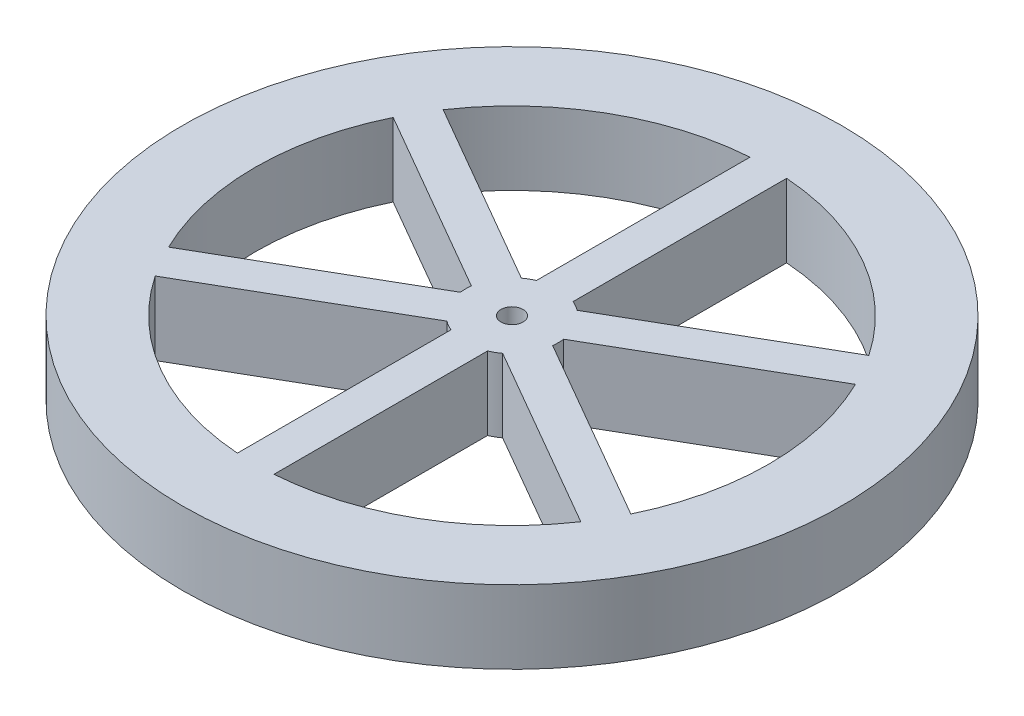
ISO-10303-21;
HEADER;
FILE_DESCRIPTION(('STEP AP214'),'2;1');
FILE_NAME('part.step','',(''),(''),'','','');
FILE_SCHEMA(('AUTOMOTIVE_DESIGN { 1 0 10303 214 1 1 1 1 }'));
ENDSEC;
DATA;
#1=APPLICATION_CONTEXT('core data for automotive mechanical design processes');
#2=APPLICATION_PROTOCOL_DEFINITION('international standard','automotive_design',2000,#1);
#3=PRODUCT_CONTEXT('',#1,'mechanical');
#4=PRODUCT('Part','Part','',(#3));
#5=PRODUCT_RELATED_PRODUCT_CATEGORY('part','',(#4));
#6=PRODUCT_DEFINITION_FORMATION('','',#4);
#7=PRODUCT_DEFINITION_CONTEXT('part definition',#1,'design');
#8=PRODUCT_DEFINITION('design','',#6,#7);
#9=PRODUCT_DEFINITION_SHAPE('','',#8);
#10=(LENGTH_UNIT() NAMED_UNIT(*) SI_UNIT(.MILLI.,.METRE.));
#11=(NAMED_UNIT(*) PLANE_ANGLE_UNIT() SI_UNIT($,.RADIAN.));
#12=(NAMED_UNIT(*) SI_UNIT($,.STERADIAN.) SOLID_ANGLE_UNIT());
#13=UNCERTAINTY_MEASURE_WITH_UNIT(LENGTH_MEASURE(1.E-05),#10,'distance_accuracy_value','');
#14=(GEOMETRIC_REPRESENTATION_CONTEXT(3) GLOBAL_UNCERTAINTY_ASSIGNED_CONTEXT((#13)) GLOBAL_UNIT_ASSIGNED_CONTEXT((#10,
#11,#12)) REPRESENTATION_CONTEXT('',''));
#15=CARTESIAN_POINT('',(0.,0.,0.));
#16=DIRECTION('',(0.,0.,1.));
#17=DIRECTION('',(1.,0.,0.));
#18=AXIS2_PLACEMENT_3D('',#15,#16,#17);
#19=CARTESIAN_POINT('',(0.,10.,0.));
#20=DIRECTION('',(0.,1.,0.));
#21=DIRECTION('',(0.,0.,1.));
#22=AXIS2_PLACEMENT_3D('',#19,#20,#21);
#23=PLANE('',#22);
#24=CARTESIAN_POINT('',(0.,10.,0.));
#25=DIRECTION('',(0.,1.,0.));
#26=DIRECTION('',(0.,0.,1.));
#27=AXIS2_PLACEMENT_3D('',#24,#25,#26);
#28=CIRCLE('',#27,45.);
#29=CARTESIAN_POINT('',(0.,10.,45.));
#30=VERTEX_POINT('',#29);
#31=EDGE_CURVE('E11',#30,#30,#28,.T.);
#32=ORIENTED_EDGE('',*,*,#31,.T.);
#33=EDGE_LOOP('',(#32));
#34=FACE_BOUND('',#33,.T.);
#35=CARTESIAN_POINT('',(0.,10.,0.));
#36=DIRECTION('',(0.,1.,0.));
#37=DIRECTION('',(0.,0.,1.));
#38=AXIS2_PLACEMENT_3D('',#35,#36,#37);
#39=CIRCLE('',#38,1.5);
#40=CARTESIAN_POINT('',(0.,10.,1.5));
#41=VERTEX_POINT('',#40);
#42=EDGE_CURVE('E464',#41,#41,#39,.T.);
#43=ORIENTED_EDGE('',*,*,#42,.F.);
#44=EDGE_LOOP('',(#43));
#45=FACE_BOUND('',#44,.T.);
#46=DIRECTION('',(0.,0.,-1.));
#47=VECTOR('',#46,1.);
#48=CARTESIAN_POINT('',(-2.49999999999995,10.,-5.83716540796992));
#49=LINE('',#48,#47);
#50=CARTESIAN_POINT('',(-2.49999999999995,10.,-5.83716540796992));
#51=VERTEX_POINT('',#50);
#52=CARTESIAN_POINT('',(-2.49999999999996,10.,-35.));
#53=VERTEX_POINT('',#52);
#54=EDGE_CURVE('E424',#51,#53,#49,.T.);
#55=ORIENTED_EDGE('',*,*,#54,.F.);
#56=CARTESIAN_POINT('',(0.,10.,0.));
#57=DIRECTION('',(0.,-1.,0.));
#58=DIRECTION('',(0.,0.,1.));
#59=AXIS2_PLACEMENT_3D('',#56,#57,#58);
#60=CIRCLE('',#59,6.35000000000004);
#61=CARTESIAN_POINT('',(-3.80513352939374,10.,-5.08364621344602));
#62=VERTEX_POINT('',#61);
#63=EDGE_CURVE('E421',#62,#51,#60,.T.);
#64=ORIENTED_EDGE('',*,*,#63,.F.);
#65=DIRECTION('',(0.866025403784439,0.,0.5));
#66=VECTOR('',#65,1.);
#67=CARTESIAN_POINT('',(-3.80513352939374,10.,-5.08364621344602));
#68=LINE('',#67,#66);
#69=CARTESIAN_POINT('',(-29.0608891324554,10.,-19.665063509461));
#70=VERTEX_POINT('',#69);
#71=EDGE_CURVE('E432',#70,#62,#68,.T.);
#72=ORIENTED_EDGE('',*,*,#71,.F.);
#73=CARTESIAN_POINT('',(0.,10.,0.));
#74=DIRECTION('',(0.,1.,0.));
#75=DIRECTION('',(0.,0.,1.));
#76=AXIS2_PLACEMENT_3D('',#73,#74,#75);
#77=CIRCLE('',#76,35.0891721190455);
#78=EDGE_CURVE('E428',#53,#70,#77,.T.);
#79=ORIENTED_EDGE('',*,*,#78,.F.);
#80=EDGE_LOOP('',(#55,#64,#72,#79));
#81=FACE_BOUND('',#80,.T.);
#82=DIRECTION('',(0.866025403784438,0.,-0.5));
#83=VECTOR('',#82,1.);
#84=CARTESIAN_POINT('',(3.80513352939373,10.,-5.08364621344601));
#85=LINE('',#84,#83);
#86=CARTESIAN_POINT('',(3.80513352939373,10.,-5.08364621344601));
#87=VERTEX_POINT('',#86);
#88=CARTESIAN_POINT('',(29.0608891324554,10.,-19.6650635094611));
#89=VERTEX_POINT('',#88);
#90=EDGE_CURVE('E381',#87,#89,#85,.T.);
#91=ORIENTED_EDGE('',*,*,#90,.F.);
#92=CARTESIAN_POINT('',(0.,10.,0.));
#93=DIRECTION('',(0.,-1.,0.));
#94=DIRECTION('',(0.,0.,1.));
#95=AXIS2_PLACEMENT_3D('',#92,#93,#94);
#96=CIRCLE('',#95,6.35000000000004);
#97=CARTESIAN_POINT('',(2.49999999999996,10.,-5.83716540796993));
#98=VERTEX_POINT('',#97);
#99=EDGE_CURVE('E378',#98,#87,#96,.T.);
#100=ORIENTED_EDGE('',*,*,#99,.F.);
#101=DIRECTION('',(0.,0.,1.));
#102=VECTOR('',#101,1.);
#103=CARTESIAN_POINT('',(2.49999999999996,10.,-5.83716540796993));
#104=LINE('',#103,#102);
#105=CARTESIAN_POINT('',(2.49999999999996,10.,-35.));
#106=VERTEX_POINT('',#105);
#107=EDGE_CURVE('E389',#106,#98,#104,.T.);
#108=ORIENTED_EDGE('',*,*,#107,.F.);
#109=CARTESIAN_POINT('',(0.,10.,0.));
#110=DIRECTION('',(0.,1.,0.));
#111=DIRECTION('',(0.,0.,1.));
#112=AXIS2_PLACEMENT_3D('',#109,#110,#111);
#113=CIRCLE('',#112,35.0891721190455);
#114=EDGE_CURVE('E385',#89,#106,#113,.T.);
#115=ORIENTED_EDGE('',*,*,#114,.F.);
#116=EDGE_LOOP('',(#91,#100,#108,#115));
#117=FACE_BOUND('',#116,.T.);
#118=DIRECTION('',(0.866025403784439,0.,0.5));
#119=VECTOR('',#118,1.);
#120=CARTESIAN_POINT('',(6.30513352939368,10.,0.753519194523905));
#121=LINE('',#120,#119);
#122=CARTESIAN_POINT('',(6.30513352939368,10.,0.753519194523905));
#123=VERTEX_POINT('',#122);
#124=CARTESIAN_POINT('',(31.5608891324553,10.,15.3349364905389));
#125=VERTEX_POINT('',#124);
#126=EDGE_CURVE('E338',#123,#125,#121,.T.);
#127=ORIENTED_EDGE('',*,*,#126,.F.);
#128=CARTESIAN_POINT('',(0.,10.,0.));
#129=DIRECTION('',(0.,-1.,0.));
#130=DIRECTION('',(0.,0.,1.));
#131=AXIS2_PLACEMENT_3D('',#128,#129,#130);
#132=CIRCLE('',#131,6.35000000000004);
#133=CARTESIAN_POINT('',(6.30513352939369,10.,-0.753519194523908));
#134=VERTEX_POINT('',#133);
#135=EDGE_CURVE('E335',#134,#123,#132,.T.);
#136=ORIENTED_EDGE('',*,*,#135,.F.);
#137=DIRECTION('',(-0.866025403784438,0.,0.5));
#138=VECTOR('',#137,1.);
#139=CARTESIAN_POINT('',(6.30513352939369,10.,-0.753519194523908));
#140=LINE('',#139,#138);
#141=CARTESIAN_POINT('',(31.5608891324553,10.,-15.3349364905389));
#142=VERTEX_POINT('',#141);
#143=EDGE_CURVE('E346',#142,#134,#140,.T.);
#144=ORIENTED_EDGE('',*,*,#143,.F.);
#145=CARTESIAN_POINT('',(0.,10.,0.));
#146=DIRECTION('',(0.,1.,0.));
#147=DIRECTION('',(0.,0.,1.));
#148=AXIS2_PLACEMENT_3D('',#145,#146,#147);
#149=CIRCLE('',#148,35.0891721190455);
#150=EDGE_CURVE('E342',#125,#142,#149,.T.);
#151=ORIENTED_EDGE('',*,*,#150,.F.);
#152=EDGE_LOOP('',(#127,#136,#144,#151));
#153=FACE_BOUND('',#152,.T.);
#154=DIRECTION('',(0.,0.,1.));
#155=VECTOR('',#154,1.);
#156=CARTESIAN_POINT('',(2.49999999999995,10.,5.83716540796992));
#157=LINE('',#156,#155);
#158=CARTESIAN_POINT('',(2.49999999999995,10.,5.83716540796992));
#159=VERTEX_POINT('',#158);
#160=CARTESIAN_POINT('',(2.49999999999996,10.,35.));
#161=VERTEX_POINT('',#160);
#162=EDGE_CURVE('E295',#159,#161,#157,.T.);
#163=ORIENTED_EDGE('',*,*,#162,.F.);
#164=CARTESIAN_POINT('',(0.,10.,0.));
#165=DIRECTION('',(0.,-1.,0.));
#166=DIRECTION('',(0.,0.,1.));
#167=AXIS2_PLACEMENT_3D('',#164,#165,#166);
#168=CIRCLE('',#167,6.35000000000004);
#169=CARTESIAN_POINT('',(3.80513352939374,10.,5.08364621344602));
#170=VERTEX_POINT('',#169);
#171=EDGE_CURVE('E292',#170,#159,#168,.T.);
#172=ORIENTED_EDGE('',*,*,#171,.F.);
#173=DIRECTION('',(-0.866025403784439,0.,-0.5));
#174=VECTOR('',#173,1.);
#175=CARTESIAN_POINT('',(3.80513352939374,10.,5.08364621344602));
#176=LINE('',#175,#174);
#177=CARTESIAN_POINT('',(29.0608891324554,10.,19.665063509461));
#178=VERTEX_POINT('',#177);
#179=EDGE_CURVE('E303',#178,#170,#176,.T.);
#180=ORIENTED_EDGE('',*,*,#179,.F.);
#181=CARTESIAN_POINT('',(0.,10.,0.));
#182=DIRECTION('',(0.,1.,0.));
#183=DIRECTION('',(0.,0.,1.));
#184=AXIS2_PLACEMENT_3D('',#181,#182,#183);
#185=CIRCLE('',#184,35.0891721190455);
#186=EDGE_CURVE('E299',#161,#178,#185,.T.);
#187=ORIENTED_EDGE('',*,*,#186,.F.);
#188=EDGE_LOOP('',(#163,#172,#180,#187));
#189=FACE_BOUND('',#188,.T.);
#190=DIRECTION('',(-0.866025403784438,0.,0.5));
#191=VECTOR('',#190,1.);
#192=CARTESIAN_POINT('',(-3.80513352939373,10.,5.08364621344602));
#193=LINE('',#192,#191);
#194=CARTESIAN_POINT('',(-3.80513352939373,10.,5.08364621344602));
#195=VERTEX_POINT('',#194);
#196=CARTESIAN_POINT('',(-29.0608891324554,10.,19.6650635094611));
#197=VERTEX_POINT('',#196);
#198=EDGE_CURVE('E252',#195,#197,#193,.T.);
#199=ORIENTED_EDGE('',*,*,#198,.F.);
#200=CARTESIAN_POINT('',(0.,10.,0.));
#201=DIRECTION('',(0.,-1.,0.));
#202=DIRECTION('',(0.,0.,1.));
#203=AXIS2_PLACEMENT_3D('',#200,#201,#202);
#204=CIRCLE('',#203,6.35000000000004);
#205=CARTESIAN_POINT('',(-2.49999999999995,10.,5.83716540796993));
#206=VERTEX_POINT('',#205);
#207=EDGE_CURVE('E249',#206,#195,#204,.T.);
#208=ORIENTED_EDGE('',*,*,#207,.F.);
#209=DIRECTION('',(0.,0.,-1.));
#210=VECTOR('',#209,1.);
#211=CARTESIAN_POINT('',(-2.49999999999995,10.,5.83716540796993));
#212=LINE('',#211,#210);
#213=CARTESIAN_POINT('',(-2.49999999999995,10.,35.));
#214=VERTEX_POINT('',#213);
#215=EDGE_CURVE('E260',#214,#206,#212,.T.);
#216=ORIENTED_EDGE('',*,*,#215,.F.);
#217=CARTESIAN_POINT('',(0.,10.,0.));
#218=DIRECTION('',(0.,1.,0.));
#219=DIRECTION('',(0.,0.,1.));
#220=AXIS2_PLACEMENT_3D('',#217,#218,#219);
#221=CIRCLE('',#220,35.0891721190455);
#222=EDGE_CURVE('E256',#197,#214,#221,.T.);
#223=ORIENTED_EDGE('',*,*,#222,.F.);
#224=EDGE_LOOP('',(#199,#208,#216,#223));
#225=FACE_BOUND('',#224,.T.);
#226=DIRECTION('',(-0.866025403784439,0.,-0.499999999999999));
#227=VECTOR('',#226,1.);
#228=CARTESIAN_POINT('',(-6.30513352939368,10.,-0.753519194523902));
#229=LINE('',#228,#227);
#230=CARTESIAN_POINT('',(-6.30513352939368,10.,-0.753519194523902));
#231=VERTEX_POINT('',#230);
#232=CARTESIAN_POINT('',(-31.5608891324553,10.,-15.3349364905389));
#233=VERTEX_POINT('',#232);
#234=EDGE_CURVE('E210',#231,#233,#229,.T.);
#235=ORIENTED_EDGE('',*,*,#234,.F.);
#236=CARTESIAN_POINT('',(0.,10.,0.));
#237=DIRECTION('',(0.,-1.,0.));
#238=DIRECTION('',(0.,0.,1.));
#239=AXIS2_PLACEMENT_3D('',#236,#237,#238);
#240=CIRCLE('',#239,6.35000000000004);
#241=CARTESIAN_POINT('',(-6.30513352939369,10.,0.75351919452391));
#242=VERTEX_POINT('',#241);
#243=EDGE_CURVE('E201',#242,#231,#240,.T.);
#244=ORIENTED_EDGE('',*,*,#243,.F.);
#245=DIRECTION('',(0.866025403784438,0.,-0.5));
#246=VECTOR('',#245,1.);
#247=CARTESIAN_POINT('',(-6.30513352939369,10.,0.75351919452391));
#248=LINE('',#247,#246);
#249=CARTESIAN_POINT('',(-31.5608891324553,10.,15.334936490539));
#250=VERTEX_POINT('',#249);
#251=EDGE_CURVE('E227',#250,#242,#248,.T.);
#252=ORIENTED_EDGE('',*,*,#251,.F.);
#253=CARTESIAN_POINT('',(0.,10.,0.));
#254=DIRECTION('',(0.,1.,0.));
#255=DIRECTION('',(0.,0.,1.));
#256=AXIS2_PLACEMENT_3D('',#253,#254,#255);
#257=CIRCLE('',#256,35.0891721190455);
#258=EDGE_CURVE('E223',#233,#250,#257,.T.);
#259=ORIENTED_EDGE('',*,*,#258,.F.);
#260=EDGE_LOOP('',(#235,#244,#252,#259));
#261=FACE_BOUND('',#260,.T.);
#262=ADVANCED_FACE('F39',(#34,#45,#81,#117,#153,#189,#225,#261),#23,.T.);
#263=CARTESIAN_POINT('',(0.,0.,0.));
#264=DIRECTION('',(0.,1.,0.));
#265=DIRECTION('',(0.,0.,1.));
#266=AXIS2_PLACEMENT_3D('',#263,#264,#265);
#267=PLANE('',#266);
#268=CARTESIAN_POINT('',(0.,0.,0.));
#269=DIRECTION('',(0.,-1.,0.));
#270=DIRECTION('',(0.,0.,1.));
#271=AXIS2_PLACEMENT_3D('',#268,#269,#270);
#272=CIRCLE('',#271,6.35000000000004);
#273=CARTESIAN_POINT('',(-2.49999999999995,0.,5.83716540796993));
#274=VERTEX_POINT('',#273);
#275=CARTESIAN_POINT('',(-3.80513352939373,0.,5.08364621344602));
#276=VERTEX_POINT('',#275);
#277=EDGE_CURVE('E219',#274,#276,#272,.T.);
#278=ORIENTED_EDGE('',*,*,#277,.T.);
#279=DIRECTION('',(-0.866025403784438,0.,0.5));
#280=VECTOR('',#279,1.);
#281=CARTESIAN_POINT('',(-3.80513352939373,0.,5.08364621344602));
#282=LINE('',#281,#280);
#283=CARTESIAN_POINT('',(-29.0608891324554,0.,19.6650635094611));
#284=VERTEX_POINT('',#283);
#285=EDGE_CURVE('E267',#276,#284,#282,.T.);
#286=ORIENTED_EDGE('',*,*,#285,.T.);
#287=CARTESIAN_POINT('',(0.,0.,0.));
#288=DIRECTION('',(0.,1.,0.));
#289=DIRECTION('',(0.,0.,1.));
#290=AXIS2_PLACEMENT_3D('',#287,#288,#289);
#291=CIRCLE('',#290,35.0891721190455);
#292=CARTESIAN_POINT('',(-2.49999999999995,0.,35.));
#293=VERTEX_POINT('',#292);
#294=EDGE_CURVE('E271',#284,#293,#291,.T.);
#295=ORIENTED_EDGE('',*,*,#294,.T.);
#296=DIRECTION('',(0.,0.,-1.));
#297=VECTOR('',#296,1.);
#298=CARTESIAN_POINT('',(-2.49999999999995,0.,5.83716540796993));
#299=LINE('',#298,#297);
#300=EDGE_CURVE('E253',#293,#274,#299,.T.);
#301=ORIENTED_EDGE('',*,*,#300,.T.);
#302=EDGE_LOOP('',(#278,#286,#295,#301));
#303=FACE_BOUND('',#302,.T.);
#304=CARTESIAN_POINT('',(0.,0.,0.));
#305=DIRECTION('',(0.,-1.,0.));
#306=DIRECTION('',(0.,0.,1.));
#307=AXIS2_PLACEMENT_3D('',#304,#305,#306);
#308=CIRCLE('',#307,6.35000000000004);
#309=CARTESIAN_POINT('',(6.30513352939369,0.,-0.753519194523907));
#310=VERTEX_POINT('',#309);
#311=CARTESIAN_POINT('',(6.30513352939368,0.,0.753519194523905));
#312=VERTEX_POINT('',#311);
#313=EDGE_CURVE('E334',#310,#312,#308,.T.);
#314=ORIENTED_EDGE('',*,*,#313,.T.);
#315=DIRECTION('',(0.866025403784439,0.,0.5));
#316=VECTOR('',#315,1.);
#317=CARTESIAN_POINT('',(6.30513352939368,0.,0.753519194523905));
#318=LINE('',#317,#316);
#319=CARTESIAN_POINT('',(31.5608891324553,0.,15.3349364905389));
#320=VERTEX_POINT('',#319);
#321=EDGE_CURVE('E353',#312,#320,#318,.T.);
#322=ORIENTED_EDGE('',*,*,#321,.T.);
#323=CARTESIAN_POINT('',(0.,0.,0.));
#324=DIRECTION('',(0.,1.,0.));
#325=DIRECTION('',(0.,0.,1.));
#326=AXIS2_PLACEMENT_3D('',#323,#324,#325);
#327=CIRCLE('',#326,35.0891721190455);
#328=CARTESIAN_POINT('',(31.5608891324553,0.,-15.3349364905389));
#329=VERTEX_POINT('',#328);
#330=EDGE_CURVE('E357',#320,#329,#327,.T.);
#331=ORIENTED_EDGE('',*,*,#330,.T.);
#332=DIRECTION('',(-0.866025403784438,0.,0.5));
#333=VECTOR('',#332,1.);
#334=CARTESIAN_POINT('',(6.30513352939369,0.,-0.753519194523908));
#335=LINE('',#334,#333);
#336=EDGE_CURVE('E339',#329,#310,#335,.T.);
#337=ORIENTED_EDGE('',*,*,#336,.T.);
#338=EDGE_LOOP('',(#314,#322,#331,#337));
#339=FACE_BOUND('',#338,.T.);
#340=CARTESIAN_POINT('',(0.,0.,0.));
#341=DIRECTION('',(0.,-1.,0.));
#342=DIRECTION('',(0.,0.,1.));
#343=AXIS2_PLACEMENT_3D('',#340,#341,#342);
#344=CIRCLE('',#343,6.35000000000004);
#345=CARTESIAN_POINT('',(-3.80513352939374,0.,-5.08364621344602));
#346=VERTEX_POINT('',#345);
#347=CARTESIAN_POINT('',(-2.49999999999995,0.,-5.83716540796992));
#348=VERTEX_POINT('',#347);
#349=EDGE_CURVE('E420',#346,#348,#344,.T.);
#350=ORIENTED_EDGE('',*,*,#349,.T.);
#351=DIRECTION('',(0.,0.,-1.));
#352=VECTOR('',#351,1.);
#353=CARTESIAN_POINT('',(-2.49999999999995,0.,-5.83716540796992));
#354=LINE('',#353,#352);
#355=CARTESIAN_POINT('',(-2.49999999999996,0.,-35.));
#356=VERTEX_POINT('',#355);
#357=EDGE_CURVE('E439',#348,#356,#354,.T.);
#358=ORIENTED_EDGE('',*,*,#357,.T.);
#359=CARTESIAN_POINT('',(0.,0.,0.));
#360=DIRECTION('',(0.,1.,0.));
#361=DIRECTION('',(0.,0.,1.));
#362=AXIS2_PLACEMENT_3D('',#359,#360,#361);
#363=CIRCLE('',#362,35.0891721190455);
#364=CARTESIAN_POINT('',(-29.0608891324554,0.,-19.665063509461));
#365=VERTEX_POINT('',#364);
#366=EDGE_CURVE('E443',#356,#365,#363,.T.);
#367=ORIENTED_EDGE('',*,*,#366,.T.);
#368=DIRECTION('',(0.866025403784439,0.,0.5));
#369=VECTOR('',#368,1.);
#370=CARTESIAN_POINT('',(-3.80513352939374,0.,-5.08364621344602));
#371=LINE('',#370,#369);
#372=EDGE_CURVE('E425',#365,#346,#371,.T.);
#373=ORIENTED_EDGE('',*,*,#372,.T.);
#374=EDGE_LOOP('',(#350,#358,#367,#373));
#375=FACE_BOUND('',#374,.T.);
#376=CARTESIAN_POINT('',(0.,0.,0.));
#377=DIRECTION('',(0.,1.,0.));
#378=DIRECTION('',(0.,0.,1.));
#379=AXIS2_PLACEMENT_3D('',#376,#377,#378);
#380=CIRCLE('',#379,45.);
#381=CARTESIAN_POINT('',(0.,0.,45.));
#382=VERTEX_POINT('',#381);
#383=EDGE_CURVE('E43',#382,#382,#380,.T.);
#384=ORIENTED_EDGE('',*,*,#383,.F.);
#385=EDGE_LOOP('',(#384));
#386=FACE_BOUND('',#385,.T.);
#387=CARTESIAN_POINT('',(0.,0.,0.));
#388=DIRECTION('',(0.,1.,0.));
#389=DIRECTION('',(0.,0.,1.));
#390=AXIS2_PLACEMENT_3D('',#387,#388,#389);
#391=CIRCLE('',#390,1.5);
#392=CARTESIAN_POINT('',(0.,0.,1.5));
#393=VERTEX_POINT('',#392);
#394=EDGE_CURVE('E463',#393,#393,#391,.T.);
#395=ORIENTED_EDGE('',*,*,#394,.T.);
#396=EDGE_LOOP('',(#395));
#397=FACE_BOUND('',#396,.T.);
#398=CARTESIAN_POINT('',(0.,0.,0.));
#399=DIRECTION('',(0.,-1.,0.));
#400=DIRECTION('',(0.,0.,1.));
#401=AXIS2_PLACEMENT_3D('',#398,#399,#400);
#402=CIRCLE('',#401,6.35000000000004);
#403=CARTESIAN_POINT('',(2.49999999999996,0.,-5.83716540796993));
#404=VERTEX_POINT('',#403);
#405=CARTESIAN_POINT('',(3.80513352939373,0.,-5.08364621344601));
#406=VERTEX_POINT('',#405);
#407=EDGE_CURVE('E377',#404,#406,#402,.T.);
#408=ORIENTED_EDGE('',*,*,#407,.T.);
#409=DIRECTION('',(0.866025403784438,0.,-0.5));
#410=VECTOR('',#409,1.);
#411=CARTESIAN_POINT('',(3.80513352939373,0.,-5.08364621344601));
#412=LINE('',#411,#410);
#413=CARTESIAN_POINT('',(29.0608891324554,0.,-19.6650635094611));
#414=VERTEX_POINT('',#413);
#415=EDGE_CURVE('E396',#406,#414,#412,.T.);
#416=ORIENTED_EDGE('',*,*,#415,.T.);
#417=CARTESIAN_POINT('',(0.,0.,0.));
#418=DIRECTION('',(0.,1.,0.));
#419=DIRECTION('',(0.,0.,1.));
#420=AXIS2_PLACEMENT_3D('',#417,#418,#419);
#421=CIRCLE('',#420,35.0891721190455);
#422=CARTESIAN_POINT('',(2.49999999999996,0.,-35.));
#423=VERTEX_POINT('',#422);
#424=EDGE_CURVE('E400',#414,#423,#421,.T.);
#425=ORIENTED_EDGE('',*,*,#424,.T.);
#426=DIRECTION('',(0.,0.,1.));
#427=VECTOR('',#426,1.);
#428=CARTESIAN_POINT('',(2.49999999999996,0.,-5.83716540796993));
#429=LINE('',#428,#427);
#430=EDGE_CURVE('E382',#423,#404,#429,.T.);
#431=ORIENTED_EDGE('',*,*,#430,.T.);
#432=EDGE_LOOP('',(#408,#416,#425,#431));
#433=FACE_BOUND('',#432,.T.);
#434=CARTESIAN_POINT('',(0.,0.,0.));
#435=DIRECTION('',(0.,-1.,0.));
#436=DIRECTION('',(0.,0.,1.));
#437=AXIS2_PLACEMENT_3D('',#434,#435,#436);
#438=CIRCLE('',#437,6.35000000000004);
#439=CARTESIAN_POINT('',(3.80513352939374,0.,5.08364621344602));
#440=VERTEX_POINT('',#439);
#441=CARTESIAN_POINT('',(2.49999999999995,0.,5.83716540796992));
#442=VERTEX_POINT('',#441);
#443=EDGE_CURVE('E291',#440,#442,#438,.T.);
#444=ORIENTED_EDGE('',*,*,#443,.T.);
#445=DIRECTION('',(0.,0.,1.));
#446=VECTOR('',#445,1.);
#447=CARTESIAN_POINT('',(2.49999999999995,0.,5.83716540796992));
#448=LINE('',#447,#446);
#449=CARTESIAN_POINT('',(2.49999999999996,0.,35.));
#450=VERTEX_POINT('',#449);
#451=EDGE_CURVE('E310',#442,#450,#448,.T.);
#452=ORIENTED_EDGE('',*,*,#451,.T.);
#453=CARTESIAN_POINT('',(0.,0.,0.));
#454=DIRECTION('',(0.,1.,0.));
#455=DIRECTION('',(0.,0.,1.));
#456=AXIS2_PLACEMENT_3D('',#453,#454,#455);
#457=CIRCLE('',#456,35.0891721190455);
#458=CARTESIAN_POINT('',(29.0608891324554,0.,19.665063509461));
#459=VERTEX_POINT('',#458);
#460=EDGE_CURVE('E314',#450,#459,#457,.T.);
#461=ORIENTED_EDGE('',*,*,#460,.T.);
#462=DIRECTION('',(-0.866025403784439,0.,-0.5));
#463=VECTOR('',#462,1.);
#464=CARTESIAN_POINT('',(3.80513352939374,0.,5.08364621344602));
#465=LINE('',#464,#463);
#466=EDGE_CURVE('E296',#459,#440,#465,.T.);
#467=ORIENTED_EDGE('',*,*,#466,.T.);
#468=EDGE_LOOP('',(#444,#452,#461,#467));
#469=FACE_BOUND('',#468,.T.);
#470=CARTESIAN_POINT('',(0.,0.,0.));
#471=DIRECTION('',(0.,-1.,0.));
#472=DIRECTION('',(0.,0.,1.));
#473=AXIS2_PLACEMENT_3D('',#470,#471,#472);
#474=CIRCLE('',#473,6.35000000000004);
#475=CARTESIAN_POINT('',(-6.30513352939369,0.,0.75351919452391));
#476=VERTEX_POINT('',#475);
#477=CARTESIAN_POINT('',(-6.30513352939368,0.,-0.753519194523902));
#478=VERTEX_POINT('',#477);
#479=EDGE_CURVE('E63',#476,#478,#474,.T.);
#480=ORIENTED_EDGE('',*,*,#479,.T.);
#481=DIRECTION('',(-0.866025403784439,0.,-0.499999999999999));
#482=VECTOR('',#481,1.);
#483=CARTESIAN_POINT('',(-6.30513352939368,0.,-0.753519194523902));
#484=LINE('',#483,#482);
#485=CARTESIAN_POINT('',(-31.5608891324553,0.,-15.3349364905389));
#486=VERTEX_POINT('',#485);
#487=EDGE_CURVE('E217',#478,#486,#484,.T.);
#488=ORIENTED_EDGE('',*,*,#487,.T.);
#489=CARTESIAN_POINT('',(0.,0.,0.));
#490=DIRECTION('',(0.,1.,0.));
#491=DIRECTION('',(0.,0.,1.));
#492=AXIS2_PLACEMENT_3D('',#489,#490,#491);
#493=CIRCLE('',#492,35.0891721190455);
#494=CARTESIAN_POINT('',(-31.5608891324553,0.,15.334936490539));
#495=VERTEX_POINT('',#494);
#496=EDGE_CURVE('E236',#486,#495,#493,.T.);
#497=ORIENTED_EDGE('',*,*,#496,.T.);
#498=DIRECTION('',(0.866025403784438,0.,-0.5));
#499=VECTOR('',#498,1.);
#500=CARTESIAN_POINT('',(-6.30513352939369,0.,0.75351919452391));
#501=LINE('',#500,#499);
#502=EDGE_CURVE('E211',#495,#476,#501,.T.);
#503=ORIENTED_EDGE('',*,*,#502,.T.);
#504=EDGE_LOOP('',(#480,#488,#497,#503));
#505=FACE_BOUND('',#504,.T.);
#506=ADVANCED_FACE('F472',(#303,#339,#375,#386,#397,#433,#469,#505),#267,.F.);
#507=CARTESIAN_POINT('',(0.,10.,0.));
#508=DIRECTION('',(0.,-1.,0.));
#509=DIRECTION('',(0.,0.,-1.));
#510=AXIS2_PLACEMENT_3D('',#507,#508,#509);
#511=CYLINDRICAL_SURFACE('',#510,45.);
#512=ORIENTED_EDGE('',*,*,#31,.F.);
#513=EDGE_LOOP('',(#512));
#514=FACE_BOUND('',#513,.T.);
#515=ORIENTED_EDGE('',*,*,#383,.T.);
#516=EDGE_LOOP('',(#515));
#517=FACE_BOUND('',#516,.T.);
#518=ADVANCED_FACE('F41',(#514,#517),#511,.T.);
#519=CARTESIAN_POINT('',(0.,10.,0.));
#520=DIRECTION('',(0.,-1.,0.));
#521=DIRECTION('',(0.,0.,-1.));
#522=AXIS2_PLACEMENT_3D('',#519,#520,#521);
#523=CYLINDRICAL_SURFACE('',#522,1.5);
#524=ORIENTED_EDGE('',*,*,#42,.T.);
#525=EDGE_LOOP('',(#524));
#526=FACE_BOUND('',#525,.T.);
#527=ORIENTED_EDGE('',*,*,#394,.F.);
#528=EDGE_LOOP('',(#527));
#529=FACE_BOUND('',#528,.T.);
#530=ADVANCED_FACE('F475',(#526,#529),#523,.F.);
#531=CARTESIAN_POINT('',(0.,10.,0.));
#532=DIRECTION('',(0.,-1.,0.));
#533=DIRECTION('',(0.,0.,-1.));
#534=AXIS2_PLACEMENT_3D('',#531,#532,#533);
#535=CYLINDRICAL_SURFACE('',#534,6.35000000000004);
#536=ORIENTED_EDGE('',*,*,#349,.F.);
#537=DIRECTION('',(0.,-1.,0.));
#538=VECTOR('',#537,1.);
#539=CARTESIAN_POINT('',(-3.80513352939374,10.,-5.08364621344602));
#540=LINE('',#539,#538);
#541=EDGE_CURVE('E435',#62,#346,#540,.T.);
#542=ORIENTED_EDGE('',*,*,#541,.F.);
#543=ORIENTED_EDGE('',*,*,#63,.T.);
#544=DIRECTION('',(0.,-1.,0.));
#545=VECTOR('',#544,1.);
#546=CARTESIAN_POINT('',(-2.49999999999995,10.,-5.83716540796992));
#547=LINE('',#546,#545);
#548=EDGE_CURVE('E459',#51,#348,#547,.T.);
#549=ORIENTED_EDGE('',*,*,#548,.T.);
#550=EDGE_LOOP('',(#536,#542,#543,#549));
#551=FACE_BOUND('',#550,.T.);
#552=ADVANCED_FACE('F477',(#551),#535,.T.);
#553=CARTESIAN_POINT('',(-2.49999999999995,10.,-5.83716540796992));
#554=DIRECTION('',(-1.,0.,0.));
#555=DIRECTION('',(0.,0.,1.));
#556=AXIS2_PLACEMENT_3D('',#553,#554,#555);
#557=PLANE('',#556);
#558=ORIENTED_EDGE('',*,*,#357,.F.);
#559=ORIENTED_EDGE('',*,*,#548,.F.);
#560=ORIENTED_EDGE('',*,*,#54,.T.);
#561=DIRECTION('',(0.,-1.,0.));
#562=VECTOR('',#561,1.);
#563=CARTESIAN_POINT('',(-2.49999999999996,10.,-35.));
#564=LINE('',#563,#562);
#565=EDGE_CURVE('E456',#53,#356,#564,.T.);
#566=ORIENTED_EDGE('',*,*,#565,.T.);
#567=EDGE_LOOP('',(#558,#559,#560,#566));
#568=FACE_BOUND('',#567,.T.);
#569=ADVANCED_FACE('F484',(#568),#557,.T.);
#570=CARTESIAN_POINT('',(0.,10.,0.));
#571=DIRECTION('',(0.,-1.,0.));
#572=DIRECTION('',(0.,0.,-1.));
#573=AXIS2_PLACEMENT_3D('',#570,#571,#572);
#574=CYLINDRICAL_SURFACE('',#573,35.0891721190455);
#575=ORIENTED_EDGE('',*,*,#366,.F.);
#576=ORIENTED_EDGE('',*,*,#565,.F.);
#577=ORIENTED_EDGE('',*,*,#78,.T.);
#578=DIRECTION('',(0.,-1.,0.));
#579=VECTOR('',#578,1.);
#580=CARTESIAN_POINT('',(-29.0608891324554,10.,-19.665063509461));
#581=LINE('',#580,#579);
#582=EDGE_CURVE('E453',#70,#365,#581,.T.);
#583=ORIENTED_EDGE('',*,*,#582,.T.);
#584=EDGE_LOOP('',(#575,#576,#577,#583));
#585=FACE_BOUND('',#584,.T.);
#586=ADVANCED_FACE('F598',(#585),#574,.F.);
#587=CARTESIAN_POINT('',(-3.80513352939374,10.,-5.08364621344602));
#588=DIRECTION('',(0.5,0.,-0.866025403784439));
#589=DIRECTION('',(-0.866025403784439,0.,-0.5));
#590=AXIS2_PLACEMENT_3D('',#587,#588,#589);
#591=PLANE('',#590);
#592=ORIENTED_EDGE('',*,*,#372,.F.);
#593=ORIENTED_EDGE('',*,*,#582,.F.);
#594=ORIENTED_EDGE('',*,*,#71,.T.);
#595=ORIENTED_EDGE('',*,*,#541,.T.);
#596=EDGE_LOOP('',(#592,#593,#594,#595));
#597=FACE_BOUND('',#596,.T.);
#598=ADVANCED_FACE('F594',(#597),#591,.T.);
#599=CARTESIAN_POINT('',(0.,10.,0.));
#600=DIRECTION('',(0.,-1.,0.));
#601=DIRECTION('',(0.,0.,-1.));
#602=AXIS2_PLACEMENT_3D('',#599,#600,#601);
#603=CYLINDRICAL_SURFACE('',#602,6.35000000000004);
#604=ORIENTED_EDGE('',*,*,#407,.F.);
#605=DIRECTION('',(0.,-1.,0.));
#606=VECTOR('',#605,1.);
#607=CARTESIAN_POINT('',(2.49999999999996,10.,-5.83716540796993));
#608=LINE('',#607,#606);
#609=EDGE_CURVE('E392',#98,#404,#608,.T.);
#610=ORIENTED_EDGE('',*,*,#609,.F.);
#611=ORIENTED_EDGE('',*,*,#99,.T.);
#612=DIRECTION('',(0.,-1.,0.));
#613=VECTOR('',#612,1.);
#614=CARTESIAN_POINT('',(3.80513352939373,10.,-5.08364621344601));
#615=LINE('',#614,#613);
#616=EDGE_CURVE('E416',#87,#406,#615,.T.);
#617=ORIENTED_EDGE('',*,*,#616,.T.);
#618=EDGE_LOOP('',(#604,#610,#611,#617));
#619=FACE_BOUND('',#618,.T.);
#620=ADVANCED_FACE('F590',(#619),#603,.T.);
#621=CARTESIAN_POINT('',(3.80513352939373,10.,-5.08364621344601));
#622=DIRECTION('',(-0.5,0.,-0.866025403784439));
#623=DIRECTION('',(-0.866025403784439,0.,0.5));
#624=AXIS2_PLACEMENT_3D('',#621,#622,#623);
#625=PLANE('',#624);
#626=ORIENTED_EDGE('',*,*,#415,.F.);
#627=ORIENTED_EDGE('',*,*,#616,.F.);
#628=ORIENTED_EDGE('',*,*,#90,.T.);
#629=DIRECTION('',(0.,-1.,0.));
#630=VECTOR('',#629,1.);
#631=CARTESIAN_POINT('',(29.0608891324554,10.,-19.6650635094611));
#632=LINE('',#631,#630);
#633=EDGE_CURVE('E413',#89,#414,#632,.T.);
#634=ORIENTED_EDGE('',*,*,#633,.T.);
#635=EDGE_LOOP('',(#626,#627,#628,#634));
#636=FACE_BOUND('',#635,.T.);
#637=ADVANCED_FACE('F586',(#636),#625,.T.);
#638=CARTESIAN_POINT('',(0.,10.,0.));
#639=DIRECTION('',(0.,-1.,0.));
#640=DIRECTION('',(0.,0.,-1.));
#641=AXIS2_PLACEMENT_3D('',#638,#639,#640);
#642=CYLINDRICAL_SURFACE('',#641,35.0891721190455);
#643=ORIENTED_EDGE('',*,*,#424,.F.);
#644=ORIENTED_EDGE('',*,*,#633,.F.);
#645=ORIENTED_EDGE('',*,*,#114,.T.);
#646=DIRECTION('',(0.,-1.,0.));
#647=VECTOR('',#646,1.);
#648=CARTESIAN_POINT('',(2.49999999999996,10.,-35.));
#649=LINE('',#648,#647);
#650=EDGE_CURVE('E410',#106,#423,#649,.T.);
#651=ORIENTED_EDGE('',*,*,#650,.T.);
#652=EDGE_LOOP('',(#643,#644,#645,#651));
#653=FACE_BOUND('',#652,.T.);
#654=ADVANCED_FACE('F582',(#653),#642,.F.);
#655=CARTESIAN_POINT('',(2.49999999999996,10.,-5.83716540796993));
#656=DIRECTION('',(1.,0.,0.));
#657=DIRECTION('',(0.,0.,-1.));
#658=AXIS2_PLACEMENT_3D('',#655,#656,#657);
#659=PLANE('',#658);
#660=ORIENTED_EDGE('',*,*,#430,.F.);
#661=ORIENTED_EDGE('',*,*,#650,.F.);
#662=ORIENTED_EDGE('',*,*,#107,.T.);
#663=ORIENTED_EDGE('',*,*,#609,.T.);
#664=EDGE_LOOP('',(#660,#661,#662,#663));
#665=FACE_BOUND('',#664,.T.);
#666=ADVANCED_FACE('F578',(#665),#659,.T.);
#667=CARTESIAN_POINT('',(0.,10.,0.));
#668=DIRECTION('',(0.,-1.,0.));
#669=DIRECTION('',(0.,0.,-1.));
#670=AXIS2_PLACEMENT_3D('',#667,#668,#669);
#671=CYLINDRICAL_SURFACE('',#670,6.35000000000004);
#672=ORIENTED_EDGE('',*,*,#313,.F.);
#673=DIRECTION('',(0.,-1.,0.));
#674=VECTOR('',#673,1.);
#675=CARTESIAN_POINT('',(6.30513352939369,10.,-0.753519194523908));
#676=LINE('',#675,#674);
#677=EDGE_CURVE('E349',#134,#310,#676,.T.);
#678=ORIENTED_EDGE('',*,*,#677,.F.);
#679=ORIENTED_EDGE('',*,*,#135,.T.);
#680=DIRECTION('',(0.,-1.,0.));
#681=VECTOR('',#680,1.);
#682=CARTESIAN_POINT('',(6.30513352939368,10.,0.753519194523905));
#683=LINE('',#682,#681);
#684=EDGE_CURVE('E373',#123,#312,#683,.T.);
#685=ORIENTED_EDGE('',*,*,#684,.T.);
#686=EDGE_LOOP('',(#672,#678,#679,#685));
#687=FACE_BOUND('',#686,.T.);
#688=ADVANCED_FACE('F574',(#687),#671,.T.);
#689=CARTESIAN_POINT('',(6.30513352939368,10.,0.753519194523905));
#690=DIRECTION('',(0.5,0.,-0.866025403784439));
#691=DIRECTION('',(-0.866025403784439,0.,-0.5));
#692=AXIS2_PLACEMENT_3D('',#689,#690,#691);
#693=PLANE('',#692);
#694=ORIENTED_EDGE('',*,*,#321,.F.);
#695=ORIENTED_EDGE('',*,*,#684,.F.);
#696=ORIENTED_EDGE('',*,*,#126,.T.);
#697=DIRECTION('',(0.,-1.,0.));
#698=VECTOR('',#697,1.);
#699=CARTESIAN_POINT('',(31.5608891324553,10.,15.3349364905389));
#700=LINE('',#699,#698);
#701=EDGE_CURVE('E370',#125,#320,#700,.T.);
#702=ORIENTED_EDGE('',*,*,#701,.T.);
#703=EDGE_LOOP('',(#694,#695,#696,#702));
#704=FACE_BOUND('',#703,.T.);
#705=ADVANCED_FACE('F570',(#704),#693,.T.);
#706=CARTESIAN_POINT('',(0.,10.,0.));
#707=DIRECTION('',(0.,-1.,0.));
#708=DIRECTION('',(0.,0.,-1.));
#709=AXIS2_PLACEMENT_3D('',#706,#707,#708);
#710=CYLINDRICAL_SURFACE('',#709,35.0891721190455);
#711=ORIENTED_EDGE('',*,*,#330,.F.);
#712=ORIENTED_EDGE('',*,*,#701,.F.);
#713=ORIENTED_EDGE('',*,*,#150,.T.);
#714=DIRECTION('',(0.,-1.,0.));
#715=VECTOR('',#714,1.);
#716=CARTESIAN_POINT('',(31.5608891324553,10.,-15.3349364905389));
#717=LINE('',#716,#715);
#718=EDGE_CURVE('E367',#142,#329,#717,.T.);
#719=ORIENTED_EDGE('',*,*,#718,.T.);
#720=EDGE_LOOP('',(#711,#712,#713,#719));
#721=FACE_BOUND('',#720,.T.);
#722=ADVANCED_FACE('F566',(#721),#710,.F.);
#723=CARTESIAN_POINT('',(6.30513352939369,10.,-0.753519194523908));
#724=DIRECTION('',(0.5,0.,0.866025403784439));
#725=DIRECTION('',(0.866025403784439,0.,-0.5));
#726=AXIS2_PLACEMENT_3D('',#723,#724,#725);
#727=PLANE('',#726);
#728=ORIENTED_EDGE('',*,*,#336,.F.);
#729=ORIENTED_EDGE('',*,*,#718,.F.);
#730=ORIENTED_EDGE('',*,*,#143,.T.);
#731=ORIENTED_EDGE('',*,*,#677,.T.);
#732=EDGE_LOOP('',(#728,#729,#730,#731));
#733=FACE_BOUND('',#732,.T.);
#734=ADVANCED_FACE('F562',(#733),#727,.T.);
#735=CARTESIAN_POINT('',(0.,10.,0.));
#736=DIRECTION('',(0.,-1.,0.));
#737=DIRECTION('',(0.,0.,-1.));
#738=AXIS2_PLACEMENT_3D('',#735,#736,#737);
#739=CYLINDRICAL_SURFACE('',#738,6.35000000000004);
#740=ORIENTED_EDGE('',*,*,#443,.F.);
#741=DIRECTION('',(0.,-1.,0.));
#742=VECTOR('',#741,1.);
#743=CARTESIAN_POINT('',(3.80513352939374,10.,5.08364621344602));
#744=LINE('',#743,#742);
#745=EDGE_CURVE('E306',#170,#440,#744,.T.);
#746=ORIENTED_EDGE('',*,*,#745,.F.);
#747=ORIENTED_EDGE('',*,*,#171,.T.);
#748=DIRECTION('',(0.,-1.,0.));
#749=VECTOR('',#748,1.);
#750=CARTESIAN_POINT('',(2.49999999999995,10.,5.83716540796992));
#751=LINE('',#750,#749);
#752=EDGE_CURVE('E330',#159,#442,#751,.T.);
#753=ORIENTED_EDGE('',*,*,#752,.T.);
#754=EDGE_LOOP('',(#740,#746,#747,#753));
#755=FACE_BOUND('',#754,.T.);
#756=ADVANCED_FACE('F558',(#755),#739,.T.);
#757=CARTESIAN_POINT('',(2.49999999999995,10.,5.83716540796992));
#758=DIRECTION('',(1.,0.,0.));
#759=DIRECTION('',(0.,0.,-1.));
#760=AXIS2_PLACEMENT_3D('',#757,#758,#759);
#761=PLANE('',#760);
#762=ORIENTED_EDGE('',*,*,#451,.F.);
#763=ORIENTED_EDGE('',*,*,#752,.F.);
#764=ORIENTED_EDGE('',*,*,#162,.T.);
#765=DIRECTION('',(0.,-1.,0.));
#766=VECTOR('',#765,1.);
#767=CARTESIAN_POINT('',(2.49999999999996,10.,35.));
#768=LINE('',#767,#766);
#769=EDGE_CURVE('E327',#161,#450,#768,.T.);
#770=ORIENTED_EDGE('',*,*,#769,.T.);
#771=EDGE_LOOP('',(#762,#763,#764,#770));
#772=FACE_BOUND('',#771,.T.);
#773=ADVANCED_FACE('F554',(#772),#761,.T.);
#774=CARTESIAN_POINT('',(0.,10.,0.));
#775=DIRECTION('',(0.,-1.,0.));
#776=DIRECTION('',(0.,0.,-1.));
#777=AXIS2_PLACEMENT_3D('',#774,#775,#776);
#778=CYLINDRICAL_SURFACE('',#777,35.0891721190455);
#779=ORIENTED_EDGE('',*,*,#460,.F.);
#780=ORIENTED_EDGE('',*,*,#769,.F.);
#781=ORIENTED_EDGE('',*,*,#186,.T.);
#782=DIRECTION('',(0.,-1.,0.));
#783=VECTOR('',#782,1.);
#784=CARTESIAN_POINT('',(29.0608891324554,10.,19.665063509461));
#785=LINE('',#784,#783);
#786=EDGE_CURVE('E324',#178,#459,#785,.T.);
#787=ORIENTED_EDGE('',*,*,#786,.T.);
#788=EDGE_LOOP('',(#779,#780,#781,#787));
#789=FACE_BOUND('',#788,.T.);
#790=ADVANCED_FACE('F550',(#789),#778,.F.);
#791=CARTESIAN_POINT('',(3.80513352939374,10.,5.08364621344602));
#792=DIRECTION('',(-0.5,0.,0.866025403784439));
#793=DIRECTION('',(0.866025403784439,0.,0.5));
#794=AXIS2_PLACEMENT_3D('',#791,#792,#793);
#795=PLANE('',#794);
#796=ORIENTED_EDGE('',*,*,#466,.F.);
#797=ORIENTED_EDGE('',*,*,#786,.F.);
#798=ORIENTED_EDGE('',*,*,#179,.T.);
#799=ORIENTED_EDGE('',*,*,#745,.T.);
#800=EDGE_LOOP('',(#796,#797,#798,#799));
#801=FACE_BOUND('',#800,.T.);
#802=ADVANCED_FACE('F547',(#801),#795,.T.);
#803=CARTESIAN_POINT('',(0.,10.,0.));
#804=DIRECTION('',(0.,-1.,0.));
#805=DIRECTION('',(0.,0.,-1.));
#806=AXIS2_PLACEMENT_3D('',#803,#804,#805);
#807=CYLINDRICAL_SURFACE('',#806,6.35000000000004);
#808=ORIENTED_EDGE('',*,*,#277,.F.);
#809=DIRECTION('',(0.,-1.,0.));
#810=VECTOR('',#809,1.);
#811=CARTESIAN_POINT('',(-2.49999999999995,10.,5.83716540796993));
#812=LINE('',#811,#810);
#813=EDGE_CURVE('E263',#206,#274,#812,.T.);
#814=ORIENTED_EDGE('',*,*,#813,.F.);
#815=ORIENTED_EDGE('',*,*,#207,.T.);
#816=DIRECTION('',(0.,-1.,0.));
#817=VECTOR('',#816,1.);
#818=CARTESIAN_POINT('',(-3.80513352939373,10.,5.08364621344602));
#819=LINE('',#818,#817);
#820=EDGE_CURVE('E287',#195,#276,#819,.T.);
#821=ORIENTED_EDGE('',*,*,#820,.T.);
#822=EDGE_LOOP('',(#808,#814,#815,#821));
#823=FACE_BOUND('',#822,.T.);
#824=ADVANCED_FACE('F529',(#823),#807,.T.);
#825=CARTESIAN_POINT('',(-3.80513352939373,10.,5.08364621344602));
#826=DIRECTION('',(0.5,0.,0.866025403784438));
#827=DIRECTION('',(0.866025403784438,0.,-0.5));
#828=AXIS2_PLACEMENT_3D('',#825,#826,#827);
#829=PLANE('',#828);
#830=ORIENTED_EDGE('',*,*,#285,.F.);
#831=ORIENTED_EDGE('',*,*,#820,.F.);
#832=ORIENTED_EDGE('',*,*,#198,.T.);
#833=DIRECTION('',(0.,-1.,0.));
#834=VECTOR('',#833,1.);
#835=CARTESIAN_POINT('',(-29.0608891324554,10.,19.6650635094611));
#836=LINE('',#835,#834);
#837=EDGE_CURVE('E284',#197,#284,#836,.T.);
#838=ORIENTED_EDGE('',*,*,#837,.T.);
#839=EDGE_LOOP('',(#830,#831,#832,#838));
#840=FACE_BOUND('',#839,.T.);
#841=ADVANCED_FACE('F522',(#840),#829,.T.);
#842=CARTESIAN_POINT('',(0.,10.,0.));
#843=DIRECTION('',(0.,-1.,0.));
#844=DIRECTION('',(0.,0.,-1.));
#845=AXIS2_PLACEMENT_3D('',#842,#843,#844);
#846=CYLINDRICAL_SURFACE('',#845,35.0891721190455);
#847=ORIENTED_EDGE('',*,*,#294,.F.);
#848=ORIENTED_EDGE('',*,*,#837,.F.);
#849=ORIENTED_EDGE('',*,*,#222,.T.);
#850=DIRECTION('',(0.,-1.,0.));
#851=VECTOR('',#850,1.);
#852=CARTESIAN_POINT('',(-2.49999999999995,10.,35.));
#853=LINE('',#852,#851);
#854=EDGE_CURVE('E281',#214,#293,#853,.T.);
#855=ORIENTED_EDGE('',*,*,#854,.T.);
#856=EDGE_LOOP('',(#847,#848,#849,#855));
#857=FACE_BOUND('',#856,.T.);
#858=ADVANCED_FACE('F525',(#857),#846,.F.);
#859=CARTESIAN_POINT('',(-2.49999999999995,10.,5.83716540796993));
#860=DIRECTION('',(-1.,0.,0.));
#861=DIRECTION('',(0.,0.,1.));
#862=AXIS2_PLACEMENT_3D('',#859,#860,#861);
#863=PLANE('',#862);
#864=ORIENTED_EDGE('',*,*,#300,.F.);
#865=ORIENTED_EDGE('',*,*,#854,.F.);
#866=ORIENTED_EDGE('',*,*,#215,.T.);
#867=ORIENTED_EDGE('',*,*,#813,.T.);
#868=EDGE_LOOP('',(#864,#865,#866,#867));
#869=FACE_BOUND('',#868,.T.);
#870=ADVANCED_FACE('F532',(#869),#863,.T.);
#871=CARTESIAN_POINT('',(0.,10.,0.));
#872=DIRECTION('',(0.,-1.,0.));
#873=DIRECTION('',(0.,0.,-1.));
#874=AXIS2_PLACEMENT_3D('',#871,#872,#873);
#875=CYLINDRICAL_SURFACE('',#874,6.35000000000004);
#876=ORIENTED_EDGE('',*,*,#479,.F.);
#877=DIRECTION('',(0.,-1.,0.));
#878=VECTOR('',#877,1.);
#879=CARTESIAN_POINT('',(-6.30513352939369,10.,0.75351919452391));
#880=LINE('',#879,#878);
#881=EDGE_CURVE('E205',#242,#476,#880,.T.);
#882=ORIENTED_EDGE('',*,*,#881,.F.);
#883=ORIENTED_EDGE('',*,*,#243,.T.);
#884=DIRECTION('',(0.,-1.,0.));
#885=VECTOR('',#884,1.);
#886=CARTESIAN_POINT('',(-6.30513352939368,10.,-0.753519194523902));
#887=LINE('',#886,#885);
#888=EDGE_CURVE('E204',#231,#478,#887,.T.);
#889=ORIENTED_EDGE('',*,*,#888,.T.);
#890=EDGE_LOOP('',(#876,#882,#883,#889));
#891=FACE_BOUND('',#890,.T.);
#892=ADVANCED_FACE('F203',(#891),#875,.T.);
#893=CARTESIAN_POINT('',(-6.30513352939368,10.,-0.753519194523902));
#894=DIRECTION('',(-0.499999999999999,0.,0.866025403784439));
#895=DIRECTION('',(0.866025403784439,0.,0.499999999999999));
#896=AXIS2_PLACEMENT_3D('',#893,#894,#895);
#897=PLANE('',#896);
#898=ORIENTED_EDGE('',*,*,#487,.F.);
#899=ORIENTED_EDGE('',*,*,#888,.F.);
#900=ORIENTED_EDGE('',*,*,#234,.T.);
#901=DIRECTION('',(0.,-1.,0.));
#902=VECTOR('',#901,1.);
#903=CARTESIAN_POINT('',(-31.5608891324553,10.,-15.3349364905389));
#904=LINE('',#903,#902);
#905=EDGE_CURVE('E220',#233,#486,#904,.T.);
#906=ORIENTED_EDGE('',*,*,#905,.T.);
#907=EDGE_LOOP('',(#898,#899,#900,#906));
#908=FACE_BOUND('',#907,.T.);
#909=ADVANCED_FACE('F214',(#908),#897,.T.);
#910=CARTESIAN_POINT('',(0.,10.,0.));
#911=DIRECTION('',(0.,-1.,0.));
#912=DIRECTION('',(0.,0.,-1.));
#913=AXIS2_PLACEMENT_3D('',#910,#911,#912);
#914=CYLINDRICAL_SURFACE('',#913,35.0891721190455);
#915=ORIENTED_EDGE('',*,*,#496,.F.);
#916=ORIENTED_EDGE('',*,*,#905,.F.);
#917=ORIENTED_EDGE('',*,*,#258,.T.);
#918=DIRECTION('',(0.,-1.,0.));
#919=VECTOR('',#918,1.);
#920=CARTESIAN_POINT('',(-31.5608891324553,10.,15.334936490539));
#921=LINE('',#920,#919);
#922=EDGE_CURVE('E55',#250,#495,#921,.T.);
#923=ORIENTED_EDGE('',*,*,#922,.T.);
#924=EDGE_LOOP('',(#915,#916,#917,#923));
#925=FACE_BOUND('',#924,.T.);
#926=ADVANCED_FACE('F708',(#925),#914,.F.);
#927=CARTESIAN_POINT('',(-6.30513352939369,10.,0.75351919452391));
#928=DIRECTION('',(-0.5,0.,-0.866025403784438));
#929=DIRECTION('',(-0.866025403784438,0.,0.5));
#930=AXIS2_PLACEMENT_3D('',#927,#928,#929);
#931=PLANE('',#930);
#932=ORIENTED_EDGE('',*,*,#502,.F.);
#933=ORIENTED_EDGE('',*,*,#922,.F.);
#934=ORIENTED_EDGE('',*,*,#251,.T.);
#935=ORIENTED_EDGE('',*,*,#881,.T.);
#936=EDGE_LOOP('',(#932,#933,#934,#935));
#937=FACE_BOUND('',#936,.T.);
#938=ADVANCED_FACE('F716',(#937),#931,.T.);
#939=CLOSED_SHELL('',(#262,#506,#518,#530,#552,#569,#586,#598,#620,#637,#654,#666,#688,#705,
#722,#734,#756,#773,#790,#802,#824,#841,#858,#870,#892,#909,#926,#938));
#940=MANIFOLD_SOLID_BREP('B2',#939);
#941=ADVANCED_BREP_SHAPE_REPRESENTATION('',(#18,#940),#14);
#942=SHAPE_DEFINITION_REPRESENTATION(#9,#941);
ENDSEC;
END-ISO-10303-21;
